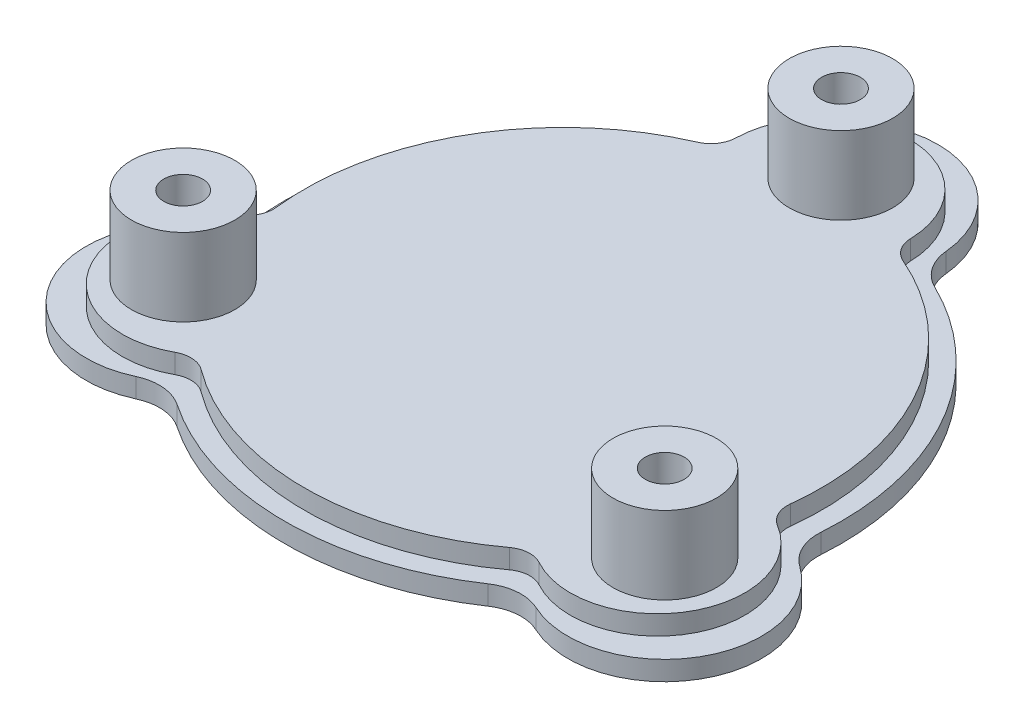
ISO-10303-21;
HEADER;
FILE_DESCRIPTION(('STEP AP214'),'2;1');
FILE_NAME('part.step','',(''),(''),'','','');
FILE_SCHEMA(('AUTOMOTIVE_DESIGN { 1 0 10303 214 1 1 1 1 }'));
ENDSEC;
DATA;
#1=APPLICATION_CONTEXT('core data for automotive mechanical design processes');
#2=APPLICATION_PROTOCOL_DEFINITION('international standard','automotive_design',2000,#1);
#3=PRODUCT_CONTEXT('',#1,'mechanical');
#4=PRODUCT('Part','Part','',(#3));
#5=PRODUCT_RELATED_PRODUCT_CATEGORY('part','',(#4));
#6=PRODUCT_DEFINITION_FORMATION('','',#4);
#7=PRODUCT_DEFINITION_CONTEXT('part definition',#1,'design');
#8=PRODUCT_DEFINITION('design','',#6,#7);
#9=PRODUCT_DEFINITION_SHAPE('','',#8);
#10=(LENGTH_UNIT() NAMED_UNIT(*) SI_UNIT(.MILLI.,.METRE.));
#11=(NAMED_UNIT(*) PLANE_ANGLE_UNIT() SI_UNIT($,.RADIAN.));
#12=(NAMED_UNIT(*) SI_UNIT($,.STERADIAN.) SOLID_ANGLE_UNIT());
#13=UNCERTAINTY_MEASURE_WITH_UNIT(LENGTH_MEASURE(1.E-05),#10,'distance_accuracy_value','');
#14=(GEOMETRIC_REPRESENTATION_CONTEXT(3) GLOBAL_UNCERTAINTY_ASSIGNED_CONTEXT((#13)) GLOBAL_UNIT_ASSIGNED_CONTEXT((#10,
#11,#12)) REPRESENTATION_CONTEXT('',''));
#15=CARTESIAN_POINT('',(0.,0.,0.));
#16=DIRECTION('',(0.,0.,1.));
#17=DIRECTION('',(1.,0.,0.));
#18=AXIS2_PLACEMENT_3D('',#15,#16,#17);
#19=CARTESIAN_POINT('',(-8.748024190987,6.,-40.1859375));
#20=DIRECTION('',(0.,1.,0.));
#21=DIRECTION('',(0.,0.,1.));
#22=AXIS2_PLACEMENT_3D('',#19,#20,#21);
#23=PLANE('',#22);
#24=CARTESIAN_POINT('',(37.2390923627308,6.,21.5000000000002));
#25=DIRECTION('',(0.,1.,0.));
#26=DIRECTION('',(0.,0.,1.));
#27=AXIS2_PLACEMENT_3D('',#24,#25,#26);
#28=CIRCLE('',#27,8.);
#29=CARTESIAN_POINT('',(37.2390923627308,6.,29.5000000000002));
#30=VERTEX_POINT('',#29);
#31=EDGE_CURVE('E669',#30,#30,#28,.T.);
#32=ORIENTED_EDGE('',*,*,#31,.F.);
#33=EDGE_LOOP('',(#32));
#34=FACE_BOUND('',#33,.T.);
#35=CARTESIAN_POINT('',(-17.496048381974,6.,-40.371875));
#36=DIRECTION('',(0.,-1.,0.));
#37=DIRECTION('',(0.,0.,1.));
#38=AXIS2_PLACEMENT_3D('',#35,#36,#37);
#39=CIRCLE('',#38,4.);
#40=CARTESIAN_POINT('',(-13.4969516089514,6.,-40.286875));
#41=VERTEX_POINT('',#40);
#42=CARTESIAN_POINT('',(-15.9054985290673,6.,-36.7017045454546));
#43=VERTEX_POINT('',#42);
#44=EDGE_CURVE('E210',#41,#43,#39,.T.);
#45=ORIENTED_EDGE('',*,*,#44,.T.);
#46=CARTESIAN_POINT('',(0.,6.,0.));
#47=DIRECTION('',(0.,1.,0.));
#48=DIRECTION('',(0.,0.,1.));
#49=AXIS2_PLACEMENT_3D('',#46,#47,#48);
#50=CIRCLE('',#49,40.);
#51=CARTESIAN_POINT('',(-39.7373577630881,6.,4.57628648669901));
#52=VERTEX_POINT('',#51);
#53=EDGE_CURVE('E199',#43,#52,#50,.T.);
#54=ORIENTED_EDGE('',*,*,#53,.T.);
#55=CARTESIAN_POINT('',(-43.7110935393969,6.,5.03391513536889));
#56=DIRECTION('',(0.,-1.,0.));
#57=DIRECTION('',(0.,0.,-1.));
#58=AXIS2_PLACEMENT_3D('',#55,#56,#57);
#59=CIRCLE('',#58,4.00000000000001);
#60=CARTESIAN_POINT('',(-41.6379329935641,6.,8.45473453299854));
#61=VERTEX_POINT('',#60);
#62=EDGE_CURVE('E209',#52,#61,#59,.T.);
#63=ORIENTED_EDGE('',*,*,#62,.T.);
#64=CARTESIAN_POINT('',(-34.6410161513777,6.,19.9999999999997));
#65=DIRECTION('',(0.,1.,0.));
#66=DIRECTION('',(0.,0.,1.));
#67=AXIS2_PLACEMENT_3D('',#64,#65,#66);
#68=CIRCLE('',#67,13.5);
#69=CARTESIAN_POINT('',(-28.1409813846125,6.,31.8321404670011));
#70=VERTEX_POINT('',#69);
#71=EDGE_CURVE('E686',#61,#70,#68,.T.);
#72=ORIENTED_EDGE('',*,*,#71,.T.);
#73=CARTESIAN_POINT('',(-26.2150451574229,6.,35.3379598646311));
#74=DIRECTION('',(0.,-1.,0.));
#75=DIRECTION('',(0.,0.,1.));
#76=AXIS2_PLACEMENT_3D('',#73,#74,#75);
#77=CIRCLE('',#76,3.99999999999999);
#78=CARTESIAN_POINT('',(-23.8318592340208,6.,32.1254180587556));
#79=VERTEX_POINT('',#78);
#80=EDGE_CURVE('E688',#70,#79,#77,.T.);
#81=ORIENTED_EDGE('',*,*,#80,.T.);
#82=CARTESIAN_POINT('',(0.,6.,0.));
#83=DIRECTION('',(0.,1.,0.));
#84=DIRECTION('',(0.,0.,1.));
#85=AXIS2_PLACEMENT_3D('',#82,#83,#84);
#86=CIRCLE('',#85,40.);
#87=CARTESIAN_POINT('',(23.8318592340208,6.,32.1254180587555));
#88=VERTEX_POINT('',#87);
#89=EDGE_CURVE('E690',#79,#88,#86,.T.);
#90=ORIENTED_EDGE('',*,*,#89,.T.);
#91=CARTESIAN_POINT('',(26.2150451574229,6.,35.3379598646311));
#92=DIRECTION('',(0.,-1.,0.));
#93=DIRECTION('',(0.,0.,-1.));
#94=AXIS2_PLACEMENT_3D('',#91,#92,#93);
#95=CIRCLE('',#94,4.);
#96=CARTESIAN_POINT('',(28.1409813846124,6.,31.8321404670013));
#97=VERTEX_POINT('',#96);
#98=EDGE_CURVE('E692',#88,#97,#95,.T.);
#99=ORIENTED_EDGE('',*,*,#98,.T.);
#100=CARTESIAN_POINT('',(34.6410161513775,6.,20.0000000000002));
#101=DIRECTION('',(0.,1.,0.));
#102=DIRECTION('',(0.,0.,1.));
#103=AXIS2_PLACEMENT_3D('',#100,#101,#102);
#104=CIRCLE('',#103,13.5);
#105=CARTESIAN_POINT('',(41.6379329935639,6.,8.45473453299885));
#106=VERTEX_POINT('',#105);
#107=EDGE_CURVE('E694',#97,#106,#104,.T.);
#108=ORIENTED_EDGE('',*,*,#107,.T.);
#109=CARTESIAN_POINT('',(43.7110935393969,6.,5.03391513536888));
#110=DIRECTION('',(0.,-1.,0.));
#111=DIRECTION('',(0.,0.,1.));
#112=AXIS2_PLACEMENT_3D('',#109,#110,#111);
#113=CIRCLE('',#112,4.);
#114=CARTESIAN_POINT('',(39.7373577630881,6.,4.57628648669898));
#115=VERTEX_POINT('',#114);
#116=EDGE_CURVE('E696',#106,#115,#113,.T.);
#117=ORIENTED_EDGE('',*,*,#116,.T.);
#118=CARTESIAN_POINT('',(0.,6.,0.));
#119=DIRECTION('',(0.,1.,0.));
#120=DIRECTION('',(0.,0.,1.));
#121=AXIS2_PLACEMENT_3D('',#118,#119,#120);
#122=CIRCLE('',#121,40.);
#123=CARTESIAN_POINT('',(15.9054985290673,6.,-36.7017045454545));
#124=VERTEX_POINT('',#123);
#125=EDGE_CURVE('E698',#115,#124,#122,.T.);
#126=ORIENTED_EDGE('',*,*,#125,.T.);
#127=CARTESIAN_POINT('',(17.496048381974,6.,-40.371875));
#128=DIRECTION('',(0.,-1.,0.));
#129=DIRECTION('',(0.,0.,-1.));
#130=AXIS2_PLACEMENT_3D('',#127,#128,#129);
#131=CIRCLE('',#130,4.);
#132=CARTESIAN_POINT('',(13.4969516089514,6.,-40.286875));
#133=VERTEX_POINT('',#132);
#134=EDGE_CURVE('E700',#124,#133,#131,.T.);
#135=ORIENTED_EDGE('',*,*,#134,.T.);
#136=CARTESIAN_POINT('',(0.,6.,-40.));
#137=DIRECTION('',(0.,1.,0.));
#138=DIRECTION('',(0.,0.,1.));
#139=AXIS2_PLACEMENT_3D('',#136,#137,#138);
#140=CIRCLE('',#139,13.5);
#141=EDGE_CURVE('E215',#133,#41,#140,.T.);
#142=ORIENTED_EDGE('',*,*,#141,.T.);
#143=EDGE_LOOP('',(#45,#54,#63,#72,#81,#90,#99,#108,#117,#126,#135,#142));
#144=FACE_BOUND('',#143,.T.);
#145=CARTESIAN_POINT('',(0.,6.,-43.));
#146=DIRECTION('',(0.,1.,0.));
#147=DIRECTION('',(0.,0.,1.));
#148=AXIS2_PLACEMENT_3D('',#145,#146,#147);
#149=CIRCLE('',#148,8.);
#150=CARTESIAN_POINT('',(0.,6.,-35.));
#151=VERTEX_POINT('',#150);
#152=EDGE_CURVE('E679',#151,#151,#149,.T.);
#153=ORIENTED_EDGE('',*,*,#152,.F.);
#154=EDGE_LOOP('',(#153));
#155=FACE_BOUND('',#154,.T.);
#156=CARTESIAN_POINT('',(-37.2390923627311,6.,21.4999999999997));
#157=DIRECTION('',(0.,1.,0.));
#158=DIRECTION('',(0.,0.,1.));
#159=AXIS2_PLACEMENT_3D('',#156,#157,#158);
#160=CIRCLE('',#159,8.);
#161=CARTESIAN_POINT('',(-37.2390923627311,6.,29.4999999999997));
#162=VERTEX_POINT('',#161);
#163=EDGE_CURVE('E659',#162,#162,#160,.T.);
#164=ORIENTED_EDGE('',*,*,#163,.F.);
#165=EDGE_LOOP('',(#164));
#166=FACE_BOUND('',#165,.T.);
#167=ADVANCED_FACE('F41',(#34,#144,#155,#166),#23,.T.);
#168=CARTESIAN_POINT('',(49.8778588175734,3.,3.49273528544831));
#169=DIRECTION('',(0.,-1.,0.));
#170=DIRECTION('',(0.,0.,-1.));
#171=AXIS2_PLACEMENT_3D('',#168,#169,#170);
#172=CYLINDRICAL_SURFACE('',#171,7.);
#173=CARTESIAN_POINT('',(49.8778588175734,0.,3.49273528544831));
#174=DIRECTION('',(0.,1.,0.));
#175=DIRECTION('',(0.,0.,1.));
#176=AXIS2_PLACEMENT_3D('',#173,#174,#175);
#177=CIRCLE('',#176,7.);
#178=CARTESIAN_POINT('',(42.8949585831131,0.,3.00375234548555));
#179=VERTEX_POINT('',#178);
#180=CARTESIAN_POINT('',(45.8564331273962,0.,9.22231951280574));
#181=VERTEX_POINT('',#180);
#182=EDGE_CURVE('E221',#179,#181,#177,.T.);
#183=ORIENTED_EDGE('',*,*,#182,.F.);
#184=DIRECTION('',(0.,-1.,0.));
#185=VECTOR('',#184,1.);
#186=CARTESIAN_POINT('',(42.8949585831131,3.,3.00375234548555));
#187=LINE('',#186,#185);
#188=CARTESIAN_POINT('',(42.8949585831131,3.,3.00375234548555));
#189=VERTEX_POINT('',#188);
#190=EDGE_CURVE('E11',#189,#179,#187,.T.);
#191=ORIENTED_EDGE('',*,*,#190,.F.);
#192=CARTESIAN_POINT('',(49.8778588175734,3.,3.49273528544831));
#193=DIRECTION('',(0.,1.,0.));
#194=DIRECTION('',(0.,0.,1.));
#195=AXIS2_PLACEMENT_3D('',#192,#193,#194);
#196=CIRCLE('',#195,7.);
#197=CARTESIAN_POINT('',(45.8564331273962,3.,9.22231951280574));
#198=VERTEX_POINT('',#197);
#199=EDGE_CURVE('E230',#189,#198,#196,.T.);
#200=ORIENTED_EDGE('',*,*,#199,.T.);
#201=DIRECTION('',(0.,-1.,0.));
#202=VECTOR('',#201,1.);
#203=CARTESIAN_POINT('',(45.8564331273962,3.,9.22231951280574));
#204=LINE('',#203,#202);
#205=EDGE_CURVE('E257',#198,#181,#204,.T.);
#206=ORIENTED_EDGE('',*,*,#205,.T.);
#207=EDGE_LOOP('',(#183,#191,#200,#206));
#208=FACE_BOUND('',#207,.T.);
#209=ADVANCED_FACE('F43',(#208),#172,.F.);
#210=CARTESIAN_POINT('',(0.,3.,0.));
#211=DIRECTION('',(0.,-1.,0.));
#212=DIRECTION('',(0.,0.,-1.));
#213=AXIS2_PLACEMENT_3D('',#210,#211,#212);
#214=CYLINDRICAL_SURFACE('',#213,43.);
#215=CARTESIAN_POINT('',(0.,0.,0.));
#216=DIRECTION('',(0.,1.,0.));
#217=DIRECTION('',(0.,0.,1.));
#218=AXIS2_PLACEMENT_3D('',#215,#216,#217);
#219=CIRCLE('',#218,43.);
#220=CARTESIAN_POINT('',(18.8461534536892,0.,-38.65));
#221=VERTEX_POINT('',#220);
#222=EDGE_CURVE('E224',#179,#221,#219,.T.);
#223=ORIENTED_EDGE('',*,*,#222,.T.);
#224=DIRECTION('',(0.,-1.,0.));
#225=VECTOR('',#224,1.);
#226=CARTESIAN_POINT('',(18.8461534536892,3.,-38.65));
#227=LINE('',#226,#225);
#228=CARTESIAN_POINT('',(18.8461534536892,3.,-38.65));
#229=VERTEX_POINT('',#228);
#230=EDGE_CURVE('E49',#229,#221,#227,.T.);
#231=ORIENTED_EDGE('',*,*,#230,.F.);
#232=CARTESIAN_POINT('',(0.,3.,0.));
#233=DIRECTION('',(0.,1.,0.));
#234=DIRECTION('',(0.,0.,1.));
#235=AXIS2_PLACEMENT_3D('',#232,#233,#234);
#236=CIRCLE('',#235,43.);
#237=EDGE_CURVE('E233',#189,#229,#236,.T.);
#238=ORIENTED_EDGE('',*,*,#237,.F.);
#239=ORIENTED_EDGE('',*,*,#190,.T.);
#240=EDGE_LOOP('',(#223,#231,#238,#239));
#241=FACE_BOUND('',#240,.T.);
#242=ADVANCED_FACE('F341',(#241),#214,.T.);
#243=CARTESIAN_POINT('',(21.9141319228944,3.,-44.9418604651163));
#244=DIRECTION('',(0.,-1.,0.));
#245=DIRECTION('',(0.,0.,-1.));
#246=AXIS2_PLACEMENT_3D('',#243,#244,#245);
#247=CYLINDRICAL_SURFACE('',#246,7.);
#248=CARTESIAN_POINT('',(21.9141319228944,0.,-44.9418604651163));
#249=DIRECTION('',(0.,1.,0.));
#250=DIRECTION('',(0.,0.,1.));
#251=AXIS2_PLACEMENT_3D('',#248,#249,#250);
#252=CIRCLE('',#251,7.);
#253=CARTESIAN_POINT('',(14.9414535837916,0.,-44.3239957716702));
#254=VERTEX_POINT('',#253);
#255=EDGE_CURVE('E260',#221,#254,#252,.F.);
#256=ORIENTED_EDGE('',*,*,#255,.T.);
#257=DIRECTION('',(0.,-1.,0.));
#258=VECTOR('',#257,1.);
#259=CARTESIAN_POINT('',(14.9414535837916,3.,-44.3239957716702));
#260=LINE('',#259,#258);
#261=CARTESIAN_POINT('',(14.9414535837916,3.,-44.3239957716702));
#262=VERTEX_POINT('',#261);
#263=EDGE_CURVE('E314',#262,#254,#260,.T.);
#264=ORIENTED_EDGE('',*,*,#263,.F.);
#265=CARTESIAN_POINT('',(21.9141319228944,3.,-44.9418604651163));
#266=DIRECTION('',(0.,1.,0.));
#267=DIRECTION('',(0.,0.,1.));
#268=AXIS2_PLACEMENT_3D('',#265,#266,#267);
#269=CIRCLE('',#268,7.);
#270=EDGE_CURVE('E236',#229,#262,#269,.F.);
#271=ORIENTED_EDGE('',*,*,#270,.F.);
#272=ORIENTED_EDGE('',*,*,#230,.T.);
#273=EDGE_LOOP('',(#256,#264,#271,#272));
#274=FACE_BOUND('',#273,.T.);
#275=ADVANCED_FACE('F321',(#274),#247,.F.);
#276=CARTESIAN_POINT('',(0.,3.,-43.));
#277=DIRECTION('',(0.,-1.,0.));
#278=DIRECTION('',(0.,0.,-1.));
#279=AXIS2_PLACEMENT_3D('',#276,#277,#278);
#280=CYLINDRICAL_SURFACE('',#279,15.);
#281=CARTESIAN_POINT('',(0.,0.,-43.));
#282=DIRECTION('',(0.,1.,0.));
#283=DIRECTION('',(0.,0.,1.));
#284=AXIS2_PLACEMENT_3D('',#281,#282,#283);
#285=CIRCLE('',#284,15.);
#286=CARTESIAN_POINT('',(-14.9414535837916,0.,-44.3239957716702));
#287=VERTEX_POINT('',#286);
#288=EDGE_CURVE('E262',#254,#287,#285,.T.);
#289=ORIENTED_EDGE('',*,*,#288,.T.);
#290=DIRECTION('',(0.,-1.,0.));
#291=VECTOR('',#290,1.);
#292=CARTESIAN_POINT('',(-14.9414535837916,3.,-44.3239957716702));
#293=LINE('',#292,#291);
#294=CARTESIAN_POINT('',(-14.9414535837916,3.,-44.3239957716702));
#295=VERTEX_POINT('',#294);
#296=EDGE_CURVE('E312',#295,#287,#293,.T.);
#297=ORIENTED_EDGE('',*,*,#296,.F.);
#298=CARTESIAN_POINT('',(0.,3.,-43.));
#299=DIRECTION('',(0.,1.,0.));
#300=DIRECTION('',(0.,0.,1.));
#301=AXIS2_PLACEMENT_3D('',#298,#299,#300);
#302=CIRCLE('',#301,15.);
#303=EDGE_CURVE('E238',#262,#295,#302,.T.);
#304=ORIENTED_EDGE('',*,*,#303,.F.);
#305=ORIENTED_EDGE('',*,*,#263,.T.);
#306=EDGE_LOOP('',(#289,#297,#304,#305));
#307=FACE_BOUND('',#306,.T.);
#308=ADVANCED_FACE('F335',(#307),#280,.T.);
#309=CARTESIAN_POINT('',(-21.9141319228944,3.,-44.9418604651163));
#310=DIRECTION('',(0.,-1.,0.));
#311=DIRECTION('',(0.,0.,-1.));
#312=AXIS2_PLACEMENT_3D('',#309,#310,#311);
#313=CYLINDRICAL_SURFACE('',#312,7.);
#314=CARTESIAN_POINT('',(-21.9141319228944,0.,-44.9418604651163));
#315=DIRECTION('',(0.,1.,0.));
#316=DIRECTION('',(0.,0.,1.));
#317=AXIS2_PLACEMENT_3D('',#314,#315,#316);
#318=CIRCLE('',#317,7.);
#319=CARTESIAN_POINT('',(-18.8461534536892,0.,-38.65));
#320=VERTEX_POINT('',#319);
#321=EDGE_CURVE('E265',#320,#287,#318,.T.);
#322=ORIENTED_EDGE('',*,*,#321,.F.);
#323=DIRECTION('',(0.,-1.,0.));
#324=VECTOR('',#323,1.);
#325=CARTESIAN_POINT('',(-18.8461534536892,3.,-38.65));
#326=LINE('',#325,#324);
#327=CARTESIAN_POINT('',(-18.8461534536892,3.,-38.65));
#328=VERTEX_POINT('',#327);
#329=EDGE_CURVE('E310',#328,#320,#326,.T.);
#330=ORIENTED_EDGE('',*,*,#329,.F.);
#331=CARTESIAN_POINT('',(-21.9141319228944,3.,-44.9418604651163));
#332=DIRECTION('',(0.,1.,0.));
#333=DIRECTION('',(0.,0.,1.));
#334=AXIS2_PLACEMENT_3D('',#331,#332,#333);
#335=CIRCLE('',#334,7.);
#336=EDGE_CURVE('E240',#328,#295,#335,.T.);
#337=ORIENTED_EDGE('',*,*,#336,.T.);
#338=ORIENTED_EDGE('',*,*,#296,.T.);
#339=EDGE_LOOP('',(#322,#330,#337,#338));
#340=FACE_BOUND('',#339,.T.);
#341=ADVANCED_FACE('F377',(#340),#313,.F.);
#342=CARTESIAN_POINT('',(0.,3.,0.));
#343=DIRECTION('',(0.,-1.,0.));
#344=DIRECTION('',(0.,0.,-1.));
#345=AXIS2_PLACEMENT_3D('',#342,#343,#344);
#346=CYLINDRICAL_SURFACE('',#345,43.);
#347=CARTESIAN_POINT('',(0.,0.,0.));
#348=DIRECTION('',(0.,1.,0.));
#349=DIRECTION('',(0.,0.,1.));
#350=AXIS2_PLACEMENT_3D('',#347,#348,#349);
#351=CIRCLE('',#350,43.);
#352=CARTESIAN_POINT('',(-42.8949585831132,0.,3.00375234548494));
#353=VERTEX_POINT('',#352);
#354=EDGE_CURVE('E268',#320,#353,#351,.T.);
#355=ORIENTED_EDGE('',*,*,#354,.T.);
#356=DIRECTION('',(0.,-1.,0.));
#357=VECTOR('',#356,1.);
#358=CARTESIAN_POINT('',(-42.8949585831132,3.,3.00375234548494));
#359=LINE('',#358,#357);
#360=CARTESIAN_POINT('',(-42.8949585831132,3.,3.00375234548494));
#361=VERTEX_POINT('',#360);
#362=EDGE_CURVE('E307',#361,#353,#359,.T.);
#363=ORIENTED_EDGE('',*,*,#362,.F.);
#364=CARTESIAN_POINT('',(0.,3.,0.));
#365=DIRECTION('',(0.,1.,0.));
#366=DIRECTION('',(0.,0.,1.));
#367=AXIS2_PLACEMENT_3D('',#364,#365,#366);
#368=CIRCLE('',#367,43.);
#369=EDGE_CURVE('E243',#328,#361,#368,.T.);
#370=ORIENTED_EDGE('',*,*,#369,.F.);
#371=ORIENTED_EDGE('',*,*,#329,.T.);
#372=EDGE_LOOP('',(#355,#363,#370,#371));
#373=FACE_BOUND('',#372,.T.);
#374=ADVANCED_FACE('F375',(#373),#346,.T.);
#375=CARTESIAN_POINT('',(-49.8778588175735,3.,3.49273528544762));
#376=DIRECTION('',(0.,-1.,0.));
#377=DIRECTION('',(0.,0.,-1.));
#378=AXIS2_PLACEMENT_3D('',#375,#376,#377);
#379=CYLINDRICAL_SURFACE('',#378,6.99999999999999);
#380=CARTESIAN_POINT('',(-49.8778588175735,0.,3.49273528544762));
#381=DIRECTION('',(0.,1.,0.));
#382=DIRECTION('',(0.,0.,1.));
#383=AXIS2_PLACEMENT_3D('',#380,#381,#382);
#384=CIRCLE('',#383,6.99999999999999);
#385=CARTESIAN_POINT('',(-45.8564331273963,0.,9.22231951280508));
#386=VERTEX_POINT('',#385);
#387=EDGE_CURVE('E270',#353,#386,#384,.F.);
#388=ORIENTED_EDGE('',*,*,#387,.T.);
#389=DIRECTION('',(0.,-1.,0.));
#390=VECTOR('',#389,1.);
#391=CARTESIAN_POINT('',(-45.8564331273963,3.,9.22231951280508));
#392=LINE('',#391,#390);
#393=CARTESIAN_POINT('',(-45.8564331273963,3.,9.22231951280508));
#394=VERTEX_POINT('',#393);
#395=EDGE_CURVE('E304',#394,#386,#392,.T.);
#396=ORIENTED_EDGE('',*,*,#395,.F.);
#397=CARTESIAN_POINT('',(-49.8778588175735,3.,3.49273528544762));
#398=DIRECTION('',(0.,1.,0.));
#399=DIRECTION('',(0.,0.,1.));
#400=AXIS2_PLACEMENT_3D('',#397,#398,#399);
#401=CIRCLE('',#400,6.99999999999999);
#402=EDGE_CURVE('E245',#361,#394,#401,.F.);
#403=ORIENTED_EDGE('',*,*,#402,.F.);
#404=ORIENTED_EDGE('',*,*,#362,.T.);
#405=EDGE_LOOP('',(#388,#396,#403,#404));
#406=FACE_BOUND('',#405,.T.);
#407=ADVANCED_FACE('F370',(#406),#379,.F.);
#408=CARTESIAN_POINT('',(-37.2390923627311,3.,21.4999999999997));
#409=DIRECTION('',(0.,-1.,0.));
#410=DIRECTION('',(0.,0.,-1.));
#411=AXIS2_PLACEMENT_3D('',#408,#409,#410);
#412=CYLINDRICAL_SURFACE('',#411,15.);
#413=CARTESIAN_POINT('',(-37.2390923627311,0.,21.4999999999997));
#414=DIRECTION('',(0.,1.,0.));
#415=DIRECTION('',(0.,0.,1.));
#416=AXIS2_PLACEMENT_3D('',#413,#414,#415);
#417=CIRCLE('',#416,15.);
#418=CARTESIAN_POINT('',(-30.914979543605,0.,35.1016762588644));
#419=VERTEX_POINT('',#418);
#420=EDGE_CURVE('E272',#386,#419,#417,.T.);
#421=ORIENTED_EDGE('',*,*,#420,.T.);
#422=DIRECTION('',(0.,-1.,0.));
#423=VECTOR('',#422,1.);
#424=CARTESIAN_POINT('',(-30.914979543605,3.,35.1016762588644));
#425=LINE('',#424,#423);
#426=CARTESIAN_POINT('',(-30.914979543605,3.,35.1016762588644));
#427=VERTEX_POINT('',#426);
#428=EDGE_CURVE('E302',#427,#419,#425,.T.);
#429=ORIENTED_EDGE('',*,*,#428,.F.);
#430=CARTESIAN_POINT('',(-37.2390923627311,3.,21.4999999999997));
#431=DIRECTION('',(0.,1.,0.));
#432=DIRECTION('',(0.,0.,1.));
#433=AXIS2_PLACEMENT_3D('',#430,#431,#432);
#434=CIRCLE('',#433,15.);
#435=EDGE_CURVE('E247',#394,#427,#434,.T.);
#436=ORIENTED_EDGE('',*,*,#435,.F.);
#437=ORIENTED_EDGE('',*,*,#395,.T.);
#438=EDGE_LOOP('',(#421,#429,#436,#437));
#439=FACE_BOUND('',#438,.T.);
#440=ADVANCED_FACE('F366',(#439),#412,.T.);
#441=CARTESIAN_POINT('',(-27.9637268946794,3.,41.4491251796679));
#442=DIRECTION('',(0.,-1.,0.));
#443=DIRECTION('',(0.,0.,-1.));
#444=AXIS2_PLACEMENT_3D('',#441,#442,#443);
#445=CYLINDRICAL_SURFACE('',#444,7.);
#446=CARTESIAN_POINT('',(-27.9637268946794,0.,41.4491251796679));
#447=DIRECTION('',(0.,1.,0.));
#448=DIRECTION('',(0.,0.,1.));
#449=AXIS2_PLACEMENT_3D('',#446,#447,#448);
#450=CIRCLE('',#449,7.);
#451=CARTESIAN_POINT('',(-24.0488051294243,0.,35.6462476545144));
#452=VERTEX_POINT('',#451);
#453=EDGE_CURVE('E275',#452,#419,#450,.T.);
#454=ORIENTED_EDGE('',*,*,#453,.F.);
#455=DIRECTION('',(0.,-1.,0.));
#456=VECTOR('',#455,1.);
#457=CARTESIAN_POINT('',(-24.0488051294243,3.,35.6462476545144));
#458=LINE('',#457,#456);
#459=CARTESIAN_POINT('',(-24.0488051294243,3.,35.6462476545144));
#460=VERTEX_POINT('',#459);
#461=EDGE_CURVE('E300',#460,#452,#458,.T.);
#462=ORIENTED_EDGE('',*,*,#461,.F.);
#463=CARTESIAN_POINT('',(-27.9637268946794,3.,41.4491251796679));
#464=DIRECTION('',(0.,1.,0.));
#465=DIRECTION('',(0.,0.,1.));
#466=AXIS2_PLACEMENT_3D('',#463,#464,#465);
#467=CIRCLE('',#466,7.);
#468=EDGE_CURVE('E249',#460,#427,#467,.T.);
#469=ORIENTED_EDGE('',*,*,#468,.T.);
#470=ORIENTED_EDGE('',*,*,#428,.T.);
#471=EDGE_LOOP('',(#454,#462,#469,#470));
#472=FACE_BOUND('',#471,.T.);
#473=ADVANCED_FACE('F362',(#472),#445,.F.);
#474=CARTESIAN_POINT('',(0.,3.,0.));
#475=DIRECTION('',(0.,-1.,0.));
#476=DIRECTION('',(0.,0.,-1.));
#477=AXIS2_PLACEMENT_3D('',#474,#475,#476);
#478=CYLINDRICAL_SURFACE('',#477,43.);
#479=CARTESIAN_POINT('',(0.,0.,0.));
#480=DIRECTION('',(0.,1.,0.));
#481=DIRECTION('',(0.,0.,1.));
#482=AXIS2_PLACEMENT_3D('',#479,#480,#481);
#483=CIRCLE('',#482,43.);
#484=CARTESIAN_POINT('',(24.0488051294238,0.,35.6462476545148));
#485=VERTEX_POINT('',#484);
#486=EDGE_CURVE('E278',#452,#485,#483,.T.);
#487=ORIENTED_EDGE('',*,*,#486,.T.);
#488=DIRECTION('',(0.,-1.,0.));
#489=VECTOR('',#488,1.);
#490=CARTESIAN_POINT('',(24.0488051294238,3.,35.6462476545148));
#491=LINE('',#490,#489);
#492=CARTESIAN_POINT('',(24.0488051294238,3.,35.6462476545148));
#493=VERTEX_POINT('',#492);
#494=EDGE_CURVE('E297',#493,#485,#491,.T.);
#495=ORIENTED_EDGE('',*,*,#494,.F.);
#496=CARTESIAN_POINT('',(0.,3.,0.));
#497=DIRECTION('',(0.,1.,0.));
#498=DIRECTION('',(0.,0.,1.));
#499=AXIS2_PLACEMENT_3D('',#496,#497,#498);
#500=CIRCLE('',#499,43.);
#501=EDGE_CURVE('E252',#460,#493,#500,.T.);
#502=ORIENTED_EDGE('',*,*,#501,.F.);
#503=ORIENTED_EDGE('',*,*,#461,.T.);
#504=EDGE_LOOP('',(#487,#495,#502,#503));
#505=FACE_BOUND('',#504,.T.);
#506=ADVANCED_FACE('F357',(#505),#478,.T.);
#507=CARTESIAN_POINT('',(27.9637268946789,3.,41.4491251796683));
#508=DIRECTION('',(0.,-1.,0.));
#509=DIRECTION('',(0.,0.,-1.));
#510=AXIS2_PLACEMENT_3D('',#507,#508,#509);
#511=CYLINDRICAL_SURFACE('',#510,7.00000000000001);
#512=CARTESIAN_POINT('',(27.9637268946789,0.,41.4491251796683));
#513=DIRECTION('',(0.,1.,0.));
#514=DIRECTION('',(0.,0.,1.));
#515=AXIS2_PLACEMENT_3D('',#512,#513,#514);
#516=CIRCLE('',#515,7.00000000000001);
#517=CARTESIAN_POINT('',(30.9149795436045,0.,35.1016762588648));
#518=VERTEX_POINT('',#517);
#519=EDGE_CURVE('E280',#485,#518,#516,.F.);
#520=ORIENTED_EDGE('',*,*,#519,.T.);
#521=DIRECTION('',(0.,-1.,0.));
#522=VECTOR('',#521,1.);
#523=CARTESIAN_POINT('',(30.9149795436045,3.,35.1016762588648));
#524=LINE('',#523,#522);
#525=CARTESIAN_POINT('',(30.9149795436045,3.,35.1016762588648));
#526=VERTEX_POINT('',#525);
#527=EDGE_CURVE('E294',#526,#518,#524,.T.);
#528=ORIENTED_EDGE('',*,*,#527,.F.);
#529=CARTESIAN_POINT('',(27.9637268946789,3.,41.4491251796683));
#530=DIRECTION('',(0.,1.,0.));
#531=DIRECTION('',(0.,0.,1.));
#532=AXIS2_PLACEMENT_3D('',#529,#530,#531);
#533=CIRCLE('',#532,7.00000000000001);
#534=EDGE_CURVE('E254',#493,#526,#533,.F.);
#535=ORIENTED_EDGE('',*,*,#534,.F.);
#536=ORIENTED_EDGE('',*,*,#494,.T.);
#537=EDGE_LOOP('',(#520,#528,#535,#536));
#538=FACE_BOUND('',#537,.T.);
#539=ADVANCED_FACE('F353',(#538),#511,.F.);
#540=CARTESIAN_POINT('',(-37.2390923627311,3.,21.4999999999997));
#541=DIRECTION('',(0.,-1.,0.));
#542=DIRECTION('',(0.,0.,-1.));
#543=AXIS2_PLACEMENT_3D('',#540,#541,#542);
#544=CYLINDRICAL_SURFACE('',#543,3.);
#545=CARTESIAN_POINT('',(-37.2390923627311,0.,21.4999999999997));
#546=DIRECTION('',(0.,1.,0.));
#547=DIRECTION('',(0.,0.,1.));
#548=AXIS2_PLACEMENT_3D('',#545,#546,#547);
#549=CIRCLE('',#548,3.);
#550=CARTESIAN_POINT('',(-37.2390923627311,0.,24.4999999999997));
#551=VERTEX_POINT('',#550);
#552=EDGE_CURVE('E288',#551,#551,#549,.T.);
#553=ORIENTED_EDGE('',*,*,#552,.F.);
#554=EDGE_LOOP('',(#553));
#555=FACE_BOUND('',#554,.T.);
#556=CARTESIAN_POINT('',(-37.2390923627311,18.,21.4999999999997));
#557=DIRECTION('',(0.,1.,0.));
#558=DIRECTION('',(0.,0.,1.));
#559=AXIS2_PLACEMENT_3D('',#556,#557,#558);
#560=CIRCLE('',#559,3.);
#561=CARTESIAN_POINT('',(-37.2390923627311,18.,24.4999999999997));
#562=VERTEX_POINT('',#561);
#563=EDGE_CURVE('E661',#562,#562,#560,.T.);
#564=ORIENTED_EDGE('',*,*,#563,.T.);
#565=EDGE_LOOP('',(#564));
#566=FACE_BOUND('',#565,.T.);
#567=ADVANCED_FACE('F452',(#555,#566),#544,.F.);
#568=CARTESIAN_POINT('',(0.,3.,-43.));
#569=DIRECTION('',(0.,-1.,0.));
#570=DIRECTION('',(0.,0.,-1.));
#571=AXIS2_PLACEMENT_3D('',#568,#569,#570);
#572=CYLINDRICAL_SURFACE('',#571,3.);
#573=CARTESIAN_POINT('',(0.,0.,-43.));
#574=DIRECTION('',(0.,1.,0.));
#575=DIRECTION('',(0.,0.,1.));
#576=AXIS2_PLACEMENT_3D('',#573,#574,#575);
#577=CIRCLE('',#576,3.);
#578=CARTESIAN_POINT('',(0.,0.,-40.));
#579=VERTEX_POINT('',#578);
#580=EDGE_CURVE('E285',#579,#579,#577,.T.);
#581=ORIENTED_EDGE('',*,*,#580,.F.);
#582=EDGE_LOOP('',(#581));
#583=FACE_BOUND('',#582,.T.);
#584=CARTESIAN_POINT('',(0.,18.,-43.));
#585=DIRECTION('',(0.,1.,0.));
#586=DIRECTION('',(0.,0.,1.));
#587=AXIS2_PLACEMENT_3D('',#584,#585,#586);
#588=CIRCLE('',#587,3.);
#589=CARTESIAN_POINT('',(0.,18.,-40.));
#590=VERTEX_POINT('',#589);
#591=EDGE_CURVE('E663',#590,#590,#588,.T.);
#592=ORIENTED_EDGE('',*,*,#591,.T.);
#593=EDGE_LOOP('',(#592));
#594=FACE_BOUND('',#593,.T.);
#595=ADVANCED_FACE('F454',(#583,#594),#572,.F.);
#596=CARTESIAN_POINT('',(37.2390923627308,3.,21.5000000000002));
#597=DIRECTION('',(0.,-1.,0.));
#598=DIRECTION('',(0.,0.,-1.));
#599=AXIS2_PLACEMENT_3D('',#596,#597,#598);
#600=CYLINDRICAL_SURFACE('',#599,15.);
#601=CARTESIAN_POINT('',(37.2390923627308,0.,21.5000000000002));
#602=DIRECTION('',(0.,1.,0.));
#603=DIRECTION('',(0.,0.,1.));
#604=AXIS2_PLACEMENT_3D('',#601,#602,#603);
#605=CIRCLE('',#604,15.);
#606=EDGE_CURVE('E282',#518,#181,#605,.T.);
#607=ORIENTED_EDGE('',*,*,#606,.T.);
#608=ORIENTED_EDGE('',*,*,#205,.F.);
#609=CARTESIAN_POINT('',(37.2390923627308,3.,21.5000000000002));
#610=DIRECTION('',(0.,1.,0.));
#611=DIRECTION('',(0.,0.,1.));
#612=AXIS2_PLACEMENT_3D('',#609,#610,#611);
#613=CIRCLE('',#612,15.);
#614=EDGE_CURVE('E256',#526,#198,#613,.T.);
#615=ORIENTED_EDGE('',*,*,#614,.F.);
#616=ORIENTED_EDGE('',*,*,#527,.T.);
#617=EDGE_LOOP('',(#607,#608,#615,#616));
#618=FACE_BOUND('',#617,.T.);
#619=ADVANCED_FACE('F348',(#618),#600,.T.);
#620=CARTESIAN_POINT('',(37.2390923627308,3.,21.5000000000002));
#621=DIRECTION('',(0.,-1.,0.));
#622=DIRECTION('',(0.,0.,-1.));
#623=AXIS2_PLACEMENT_3D('',#620,#621,#622);
#624=CYLINDRICAL_SURFACE('',#623,3.);
#625=CARTESIAN_POINT('',(37.2390923627308,0.,21.5000000000002));
#626=DIRECTION('',(0.,1.,0.));
#627=DIRECTION('',(0.,0.,1.));
#628=AXIS2_PLACEMENT_3D('',#625,#626,#627);
#629=CIRCLE('',#628,3.);
#630=CARTESIAN_POINT('',(37.2390923627308,0.,24.5000000000002));
#631=VERTEX_POINT('',#630);
#632=EDGE_CURVE('E234',#631,#631,#629,.T.);
#633=ORIENTED_EDGE('',*,*,#632,.F.);
#634=EDGE_LOOP('',(#633));
#635=FACE_BOUND('',#634,.T.);
#636=CARTESIAN_POINT('',(37.2390923627308,18.,21.5000000000002));
#637=DIRECTION('',(0.,1.,0.));
#638=DIRECTION('',(0.,0.,1.));
#639=AXIS2_PLACEMENT_3D('',#636,#637,#638);
#640=CIRCLE('',#639,3.);
#641=CARTESIAN_POINT('',(37.2390923627308,18.,24.5000000000002));
#642=VERTEX_POINT('',#641);
#643=EDGE_CURVE('E666',#642,#642,#640,.T.);
#644=ORIENTED_EDGE('',*,*,#643,.T.);
#645=EDGE_LOOP('',(#644));
#646=FACE_BOUND('',#645,.T.);
#647=ADVANCED_FACE('F446',(#635,#646),#624,.F.);
#648=CARTESIAN_POINT('',(0.,3.,0.));
#649=DIRECTION('',(0.,1.,0.));
#650=DIRECTION('',(0.,0.,1.));
#651=AXIS2_PLACEMENT_3D('',#648,#649,#650);
#652=PLANE('',#651);
#653=CARTESIAN_POINT('',(-17.496048381974,3.,-40.371875));
#654=DIRECTION('',(0.,-1.,0.));
#655=DIRECTION('',(0.,0.,1.));
#656=AXIS2_PLACEMENT_3D('',#653,#654,#655);
#657=CIRCLE('',#656,4.);
#658=CARTESIAN_POINT('',(-13.4969516089514,3.,-40.286875));
#659=VERTEX_POINT('',#658);
#660=CARTESIAN_POINT('',(-15.9054985290673,3.,-36.7017045454546));
#661=VERTEX_POINT('',#660);
#662=EDGE_CURVE('E56',#659,#661,#657,.T.);
#663=ORIENTED_EDGE('',*,*,#662,.F.);
#664=CARTESIAN_POINT('',(0.,3.,-40.));
#665=DIRECTION('',(0.,1.,0.));
#666=DIRECTION('',(0.,0.,1.));
#667=AXIS2_PLACEMENT_3D('',#664,#665,#666);
#668=CIRCLE('',#667,13.5);
#669=CARTESIAN_POINT('',(13.4969516089514,3.,-40.286875));
#670=VERTEX_POINT('',#669);
#671=EDGE_CURVE('E60',#670,#659,#668,.T.);
#672=ORIENTED_EDGE('',*,*,#671,.F.);
#673=CARTESIAN_POINT('',(17.496048381974,3.,-40.371875));
#674=DIRECTION('',(0.,-1.,0.));
#675=DIRECTION('',(0.,0.,-1.));
#676=AXIS2_PLACEMENT_3D('',#673,#674,#675);
#677=CIRCLE('',#676,4.);
#678=CARTESIAN_POINT('',(15.9054985290673,3.,-36.7017045454545));
#679=VERTEX_POINT('',#678);
#680=EDGE_CURVE('E731',#679,#670,#677,.T.);
#681=ORIENTED_EDGE('',*,*,#680,.F.);
#682=CARTESIAN_POINT('',(0.,3.,0.));
#683=DIRECTION('',(0.,1.,0.));
#684=DIRECTION('',(0.,0.,1.));
#685=AXIS2_PLACEMENT_3D('',#682,#683,#684);
#686=CIRCLE('',#685,40.);
#687=CARTESIAN_POINT('',(39.7373577630881,3.,4.57628648669898));
#688=VERTEX_POINT('',#687);
#689=EDGE_CURVE('E728',#688,#679,#686,.T.);
#690=ORIENTED_EDGE('',*,*,#689,.F.);
#691=CARTESIAN_POINT('',(43.7110935393969,3.,5.03391513536888));
#692=DIRECTION('',(0.,-1.,0.));
#693=DIRECTION('',(0.,0.,1.));
#694=AXIS2_PLACEMENT_3D('',#691,#692,#693);
#695=CIRCLE('',#694,4.);
#696=CARTESIAN_POINT('',(41.6379329935639,3.,8.45473453299885));
#697=VERTEX_POINT('',#696);
#698=EDGE_CURVE('E725',#697,#688,#695,.T.);
#699=ORIENTED_EDGE('',*,*,#698,.F.);
#700=CARTESIAN_POINT('',(34.6410161513775,3.,20.0000000000002));
#701=DIRECTION('',(0.,1.,0.));
#702=DIRECTION('',(0.,0.,1.));
#703=AXIS2_PLACEMENT_3D('',#700,#701,#702);
#704=CIRCLE('',#703,13.5);
#705=CARTESIAN_POINT('',(28.1409813846124,3.,31.8321404670013));
#706=VERTEX_POINT('',#705);
#707=EDGE_CURVE('E722',#706,#697,#704,.T.);
#708=ORIENTED_EDGE('',*,*,#707,.F.);
#709=CARTESIAN_POINT('',(26.2150451574229,3.,35.3379598646311));
#710=DIRECTION('',(0.,-1.,0.));
#711=DIRECTION('',(0.,0.,-1.));
#712=AXIS2_PLACEMENT_3D('',#709,#710,#711);
#713=CIRCLE('',#712,4.);
#714=CARTESIAN_POINT('',(23.8318592340208,3.,32.1254180587555));
#715=VERTEX_POINT('',#714);
#716=EDGE_CURVE('E719',#715,#706,#713,.T.);
#717=ORIENTED_EDGE('',*,*,#716,.F.);
#718=CARTESIAN_POINT('',(0.,3.,0.));
#719=DIRECTION('',(0.,1.,0.));
#720=DIRECTION('',(0.,0.,1.));
#721=AXIS2_PLACEMENT_3D('',#718,#719,#720);
#722=CIRCLE('',#721,40.);
#723=CARTESIAN_POINT('',(-23.8318592340208,3.,32.1254180587556));
#724=VERTEX_POINT('',#723);
#725=EDGE_CURVE('E716',#724,#715,#722,.T.);
#726=ORIENTED_EDGE('',*,*,#725,.F.);
#727=CARTESIAN_POINT('',(-26.2150451574229,3.,35.3379598646311));
#728=DIRECTION('',(0.,-1.,0.));
#729=DIRECTION('',(0.,0.,1.));
#730=AXIS2_PLACEMENT_3D('',#727,#728,#729);
#731=CIRCLE('',#730,3.99999999999999);
#732=CARTESIAN_POINT('',(-28.1409813846125,3.,31.8321404670011));
#733=VERTEX_POINT('',#732);
#734=EDGE_CURVE('E713',#733,#724,#731,.T.);
#735=ORIENTED_EDGE('',*,*,#734,.F.);
#736=CARTESIAN_POINT('',(-34.6410161513777,3.,19.9999999999997));
#737=DIRECTION('',(0.,1.,0.));
#738=DIRECTION('',(0.,0.,1.));
#739=AXIS2_PLACEMENT_3D('',#736,#737,#738);
#740=CIRCLE('',#739,13.5);
#741=CARTESIAN_POINT('',(-41.6379329935641,3.,8.45473453299854));
#742=VERTEX_POINT('',#741);
#743=EDGE_CURVE('E710',#742,#733,#740,.T.);
#744=ORIENTED_EDGE('',*,*,#743,.F.);
#745=CARTESIAN_POINT('',(-43.7110935393969,3.,5.03391513536889));
#746=DIRECTION('',(0.,-1.,0.));
#747=DIRECTION('',(0.,0.,-1.));
#748=AXIS2_PLACEMENT_3D('',#745,#746,#747);
#749=CIRCLE('',#748,4.00000000000001);
#750=CARTESIAN_POINT('',(-39.7373577630881,3.,4.57628648669901));
#751=VERTEX_POINT('',#750);
#752=EDGE_CURVE('E707',#751,#742,#749,.T.);
#753=ORIENTED_EDGE('',*,*,#752,.F.);
#754=CARTESIAN_POINT('',(0.,3.,0.));
#755=DIRECTION('',(0.,1.,0.));
#756=DIRECTION('',(0.,0.,1.));
#757=AXIS2_PLACEMENT_3D('',#754,#755,#756);
#758=CIRCLE('',#757,40.);
#759=EDGE_CURVE('E705',#661,#751,#758,.T.);
#760=ORIENTED_EDGE('',*,*,#759,.F.);
#761=EDGE_LOOP('',(#663,#672,#681,#690,#699,#708,#717,#726,#735,#744,#753,#760));
#762=FACE_BOUND('',#761,.T.);
#763=ORIENTED_EDGE('',*,*,#199,.F.);
#764=ORIENTED_EDGE('',*,*,#237,.T.);
#765=ORIENTED_EDGE('',*,*,#270,.T.);
#766=ORIENTED_EDGE('',*,*,#303,.T.);
#767=ORIENTED_EDGE('',*,*,#336,.F.);
#768=ORIENTED_EDGE('',*,*,#369,.T.);
#769=ORIENTED_EDGE('',*,*,#402,.T.);
#770=ORIENTED_EDGE('',*,*,#435,.T.);
#771=ORIENTED_EDGE('',*,*,#468,.F.);
#772=ORIENTED_EDGE('',*,*,#501,.T.);
#773=ORIENTED_EDGE('',*,*,#534,.T.);
#774=ORIENTED_EDGE('',*,*,#614,.T.);
#775=EDGE_LOOP('',(#763,#764,#765,#766,#767,#768,#769,#770,#771,#772,#773,#774));
#776=FACE_BOUND('',#775,.T.);
#777=ADVANCED_FACE('F340',(#762,#776),#652,.T.);
#778=CARTESIAN_POINT('',(0.,0.,0.));
#779=DIRECTION('',(0.,1.,0.));
#780=DIRECTION('',(0.,0.,1.));
#781=AXIS2_PLACEMENT_3D('',#778,#779,#780);
#782=PLANE('',#781);
#783=ORIENTED_EDGE('',*,*,#182,.T.);
#784=ORIENTED_EDGE('',*,*,#606,.F.);
#785=ORIENTED_EDGE('',*,*,#519,.F.);
#786=ORIENTED_EDGE('',*,*,#486,.F.);
#787=ORIENTED_EDGE('',*,*,#453,.T.);
#788=ORIENTED_EDGE('',*,*,#420,.F.);
#789=ORIENTED_EDGE('',*,*,#387,.F.);
#790=ORIENTED_EDGE('',*,*,#354,.F.);
#791=ORIENTED_EDGE('',*,*,#321,.T.);
#792=ORIENTED_EDGE('',*,*,#288,.F.);
#793=ORIENTED_EDGE('',*,*,#255,.F.);
#794=ORIENTED_EDGE('',*,*,#222,.F.);
#795=EDGE_LOOP('',(#783,#784,#785,#786,#787,#788,#789,#790,#791,#792,#793,#794));
#796=FACE_BOUND('',#795,.T.);
#797=ORIENTED_EDGE('',*,*,#580,.T.);
#798=EDGE_LOOP('',(#797));
#799=FACE_BOUND('',#798,.T.);
#800=ORIENTED_EDGE('',*,*,#552,.T.);
#801=EDGE_LOOP('',(#800));
#802=FACE_BOUND('',#801,.T.);
#803=ORIENTED_EDGE('',*,*,#632,.T.);
#804=EDGE_LOOP('',(#803));
#805=FACE_BOUND('',#804,.T.);
#806=ADVANCED_FACE('F328',(#796,#799,#802,#805),#782,.F.);
#807=CARTESIAN_POINT('',(-17.496048381974,6.,-40.371875));
#808=DIRECTION('',(0.,-1.,0.));
#809=DIRECTION('',(0.,0.,-1.));
#810=AXIS2_PLACEMENT_3D('',#807,#808,#809);
#811=CYLINDRICAL_SURFACE('',#810,4.);
#812=ORIENTED_EDGE('',*,*,#662,.T.);
#813=DIRECTION('',(0.,-1.,0.));
#814=VECTOR('',#813,1.);
#815=CARTESIAN_POINT('',(-15.9054985290673,6.,-36.7017045454546));
#816=LINE('',#815,#814);
#817=EDGE_CURVE('E204',#43,#661,#816,.T.);
#818=ORIENTED_EDGE('',*,*,#817,.F.);
#819=ORIENTED_EDGE('',*,*,#44,.F.);
#820=DIRECTION('',(0.,-1.,0.));
#821=VECTOR('',#820,1.);
#822=CARTESIAN_POINT('',(-13.4969516089514,6.,-40.286875));
#823=LINE('',#822,#821);
#824=EDGE_CURVE('E703',#41,#659,#823,.T.);
#825=ORIENTED_EDGE('',*,*,#824,.T.);
#826=EDGE_LOOP('',(#812,#818,#819,#825));
#827=FACE_BOUND('',#826,.T.);
#828=ADVANCED_FACE('F220',(#827),#811,.F.);
#829=CARTESIAN_POINT('',(0.,6.,0.));
#830=DIRECTION('',(0.,-1.,0.));
#831=DIRECTION('',(0.,0.,-1.));
#832=AXIS2_PLACEMENT_3D('',#829,#830,#831);
#833=CYLINDRICAL_SURFACE('',#832,40.);
#834=ORIENTED_EDGE('',*,*,#759,.T.);
#835=DIRECTION('',(0.,-1.,0.));
#836=VECTOR('',#835,1.);
#837=CARTESIAN_POINT('',(-39.7373577630881,6.,4.57628648669901));
#838=LINE('',#837,#836);
#839=EDGE_CURVE('E206',#52,#751,#838,.T.);
#840=ORIENTED_EDGE('',*,*,#839,.F.);
#841=ORIENTED_EDGE('',*,*,#53,.F.);
#842=ORIENTED_EDGE('',*,*,#817,.T.);
#843=EDGE_LOOP('',(#834,#840,#841,#842));
#844=FACE_BOUND('',#843,.T.);
#845=ADVANCED_FACE('F202',(#844),#833,.T.);
#846=CARTESIAN_POINT('',(-43.7110935393969,6.,5.03391513536889));
#847=DIRECTION('',(0.,-1.,0.));
#848=DIRECTION('',(0.,0.,-1.));
#849=AXIS2_PLACEMENT_3D('',#846,#847,#848);
#850=CYLINDRICAL_SURFACE('',#849,4.00000000000001);
#851=ORIENTED_EDGE('',*,*,#752,.T.);
#852=DIRECTION('',(0.,-1.,0.));
#853=VECTOR('',#852,1.);
#854=CARTESIAN_POINT('',(-41.6379329935641,6.,8.45473453299854));
#855=LINE('',#854,#853);
#856=EDGE_CURVE('E226',#61,#742,#855,.T.);
#857=ORIENTED_EDGE('',*,*,#856,.F.);
#858=ORIENTED_EDGE('',*,*,#62,.F.);
#859=ORIENTED_EDGE('',*,*,#839,.T.);
#860=EDGE_LOOP('',(#851,#857,#858,#859));
#861=FACE_BOUND('',#860,.T.);
#862=ADVANCED_FACE('F435',(#861),#850,.F.);
#863=CARTESIAN_POINT('',(-34.6410161513777,6.,19.9999999999997));
#864=DIRECTION('',(0.,-1.,0.));
#865=DIRECTION('',(0.,0.,-1.));
#866=AXIS2_PLACEMENT_3D('',#863,#864,#865);
#867=CYLINDRICAL_SURFACE('',#866,13.5);
#868=ORIENTED_EDGE('',*,*,#743,.T.);
#869=DIRECTION('',(0.,-1.,0.));
#870=VECTOR('',#869,1.);
#871=CARTESIAN_POINT('',(-28.1409813846125,6.,31.8321404670011));
#872=LINE('',#871,#870);
#873=EDGE_CURVE('E756',#70,#733,#872,.T.);
#874=ORIENTED_EDGE('',*,*,#873,.F.);
#875=ORIENTED_EDGE('',*,*,#71,.F.);
#876=ORIENTED_EDGE('',*,*,#856,.T.);
#877=EDGE_LOOP('',(#868,#874,#875,#876));
#878=FACE_BOUND('',#877,.T.);
#879=ADVANCED_FACE('F431',(#878),#867,.T.);
#880=CARTESIAN_POINT('',(-26.2150451574229,6.,35.3379598646311));
#881=DIRECTION('',(0.,-1.,0.));
#882=DIRECTION('',(0.,0.,-1.));
#883=AXIS2_PLACEMENT_3D('',#880,#881,#882);
#884=CYLINDRICAL_SURFACE('',#883,3.99999999999999);
#885=ORIENTED_EDGE('',*,*,#734,.T.);
#886=DIRECTION('',(0.,-1.,0.));
#887=VECTOR('',#886,1.);
#888=CARTESIAN_POINT('',(-23.8318592340208,6.,32.1254180587556));
#889=LINE('',#888,#887);
#890=EDGE_CURVE('E753',#79,#724,#889,.T.);
#891=ORIENTED_EDGE('',*,*,#890,.F.);
#892=ORIENTED_EDGE('',*,*,#80,.F.);
#893=ORIENTED_EDGE('',*,*,#873,.T.);
#894=EDGE_LOOP('',(#885,#891,#892,#893));
#895=FACE_BOUND('',#894,.T.);
#896=ADVANCED_FACE('F427',(#895),#884,.F.);
#897=CARTESIAN_POINT('',(0.,6.,0.));
#898=DIRECTION('',(0.,-1.,0.));
#899=DIRECTION('',(0.,0.,-1.));
#900=AXIS2_PLACEMENT_3D('',#897,#898,#899);
#901=CYLINDRICAL_SURFACE('',#900,40.);
#902=ORIENTED_EDGE('',*,*,#725,.T.);
#903=DIRECTION('',(0.,-1.,0.));
#904=VECTOR('',#903,1.);
#905=CARTESIAN_POINT('',(23.8318592340208,6.,32.1254180587555));
#906=LINE('',#905,#904);
#907=EDGE_CURVE('E750',#88,#715,#906,.T.);
#908=ORIENTED_EDGE('',*,*,#907,.F.);
#909=ORIENTED_EDGE('',*,*,#89,.F.);
#910=ORIENTED_EDGE('',*,*,#890,.T.);
#911=EDGE_LOOP('',(#902,#908,#909,#910));
#912=FACE_BOUND('',#911,.T.);
#913=ADVANCED_FACE('F423',(#912),#901,.T.);
#914=CARTESIAN_POINT('',(26.2150451574229,6.,35.3379598646311));
#915=DIRECTION('',(0.,-1.,0.));
#916=DIRECTION('',(0.,0.,-1.));
#917=AXIS2_PLACEMENT_3D('',#914,#915,#916);
#918=CYLINDRICAL_SURFACE('',#917,4.);
#919=ORIENTED_EDGE('',*,*,#716,.T.);
#920=DIRECTION('',(0.,-1.,0.));
#921=VECTOR('',#920,1.);
#922=CARTESIAN_POINT('',(28.1409813846124,6.,31.8321404670013));
#923=LINE('',#922,#921);
#924=EDGE_CURVE('E747',#97,#706,#923,.T.);
#925=ORIENTED_EDGE('',*,*,#924,.F.);
#926=ORIENTED_EDGE('',*,*,#98,.F.);
#927=ORIENTED_EDGE('',*,*,#907,.T.);
#928=EDGE_LOOP('',(#919,#925,#926,#927));
#929=FACE_BOUND('',#928,.T.);
#930=ADVANCED_FACE('F419',(#929),#918,.F.);
#931=CARTESIAN_POINT('',(34.6410161513775,6.,20.0000000000002));
#932=DIRECTION('',(0.,-1.,0.));
#933=DIRECTION('',(0.,0.,-1.));
#934=AXIS2_PLACEMENT_3D('',#931,#932,#933);
#935=CYLINDRICAL_SURFACE('',#934,13.5);
#936=ORIENTED_EDGE('',*,*,#707,.T.);
#937=DIRECTION('',(0.,-1.,0.));
#938=VECTOR('',#937,1.);
#939=CARTESIAN_POINT('',(41.6379329935639,6.,8.45473453299885));
#940=LINE('',#939,#938);
#941=EDGE_CURVE('E744',#106,#697,#940,.T.);
#942=ORIENTED_EDGE('',*,*,#941,.F.);
#943=ORIENTED_EDGE('',*,*,#107,.F.);
#944=ORIENTED_EDGE('',*,*,#924,.T.);
#945=EDGE_LOOP('',(#936,#942,#943,#944));
#946=FACE_BOUND('',#945,.T.);
#947=ADVANCED_FACE('F415',(#946),#935,.T.);
#948=CARTESIAN_POINT('',(43.7110935393969,6.,5.03391513536888));
#949=DIRECTION('',(0.,-1.,0.));
#950=DIRECTION('',(0.,0.,-1.));
#951=AXIS2_PLACEMENT_3D('',#948,#949,#950);
#952=CYLINDRICAL_SURFACE('',#951,4.);
#953=ORIENTED_EDGE('',*,*,#698,.T.);
#954=DIRECTION('',(0.,-1.,0.));
#955=VECTOR('',#954,1.);
#956=CARTESIAN_POINT('',(39.7373577630881,6.,4.57628648669898));
#957=LINE('',#956,#955);
#958=EDGE_CURVE('E741',#115,#688,#957,.T.);
#959=ORIENTED_EDGE('',*,*,#958,.F.);
#960=ORIENTED_EDGE('',*,*,#116,.F.);
#961=ORIENTED_EDGE('',*,*,#941,.T.);
#962=EDGE_LOOP('',(#953,#959,#960,#961));
#963=FACE_BOUND('',#962,.T.);
#964=ADVANCED_FACE('F411',(#963),#952,.F.);
#965=CARTESIAN_POINT('',(0.,6.,0.));
#966=DIRECTION('',(0.,-1.,0.));
#967=DIRECTION('',(0.,0.,-1.));
#968=AXIS2_PLACEMENT_3D('',#965,#966,#967);
#969=CYLINDRICAL_SURFACE('',#968,40.);
#970=ORIENTED_EDGE('',*,*,#689,.T.);
#971=DIRECTION('',(0.,-1.,0.));
#972=VECTOR('',#971,1.);
#973=CARTESIAN_POINT('',(15.9054985290673,6.,-36.7017045454545));
#974=LINE('',#973,#972);
#975=EDGE_CURVE('E738',#124,#679,#974,.T.);
#976=ORIENTED_EDGE('',*,*,#975,.F.);
#977=ORIENTED_EDGE('',*,*,#125,.F.);
#978=ORIENTED_EDGE('',*,*,#958,.T.);
#979=EDGE_LOOP('',(#970,#976,#977,#978));
#980=FACE_BOUND('',#979,.T.);
#981=ADVANCED_FACE('F407',(#980),#969,.T.);
#982=CARTESIAN_POINT('',(17.496048381974,6.,-40.371875));
#983=DIRECTION('',(0.,-1.,0.));
#984=DIRECTION('',(0.,0.,-1.));
#985=AXIS2_PLACEMENT_3D('',#982,#983,#984);
#986=CYLINDRICAL_SURFACE('',#985,4.);
#987=ORIENTED_EDGE('',*,*,#680,.T.);
#988=DIRECTION('',(0.,-1.,0.));
#989=VECTOR('',#988,1.);
#990=CARTESIAN_POINT('',(13.4969516089514,6.,-40.286875));
#991=LINE('',#990,#989);
#992=EDGE_CURVE('E735',#133,#670,#991,.T.);
#993=ORIENTED_EDGE('',*,*,#992,.F.);
#994=ORIENTED_EDGE('',*,*,#134,.F.);
#995=ORIENTED_EDGE('',*,*,#975,.T.);
#996=EDGE_LOOP('',(#987,#993,#994,#995));
#997=FACE_BOUND('',#996,.T.);
#998=ADVANCED_FACE('F403',(#997),#986,.F.);
#999=CARTESIAN_POINT('',(0.,6.,-40.));
#1000=DIRECTION('',(0.,-1.,0.));
#1001=DIRECTION('',(0.,0.,-1.));
#1002=AXIS2_PLACEMENT_3D('',#999,#1000,#1001);
#1003=CYLINDRICAL_SURFACE('',#1002,13.5);
#1004=ORIENTED_EDGE('',*,*,#671,.T.);
#1005=ORIENTED_EDGE('',*,*,#824,.F.);
#1006=ORIENTED_EDGE('',*,*,#141,.F.);
#1007=ORIENTED_EDGE('',*,*,#992,.T.);
#1008=EDGE_LOOP('',(#1004,#1005,#1006,#1007));
#1009=FACE_BOUND('',#1008,.T.);
#1010=ADVANCED_FACE('F399',(#1009),#1003,.T.);
#1011=CARTESIAN_POINT('',(0.,18.,-43.));
#1012=DIRECTION('',(0.,1.,0.));
#1013=DIRECTION('',(0.,0.,1.));
#1014=AXIS2_PLACEMENT_3D('',#1011,#1012,#1013);
#1015=PLANE('',#1014);
#1016=CARTESIAN_POINT('',(0.,18.,-43.));
#1017=DIRECTION('',(0.,1.,0.));
#1018=DIRECTION('',(0.,0.,1.));
#1019=AXIS2_PLACEMENT_3D('',#1016,#1017,#1018);
#1020=CIRCLE('',#1019,8.);
#1021=CARTESIAN_POINT('',(0.,18.,-35.));
#1022=VERTEX_POINT('',#1021);
#1023=EDGE_CURVE('E680',#1022,#1022,#1020,.T.);
#1024=ORIENTED_EDGE('',*,*,#1023,.T.);
#1025=EDGE_LOOP('',(#1024));
#1026=FACE_BOUND('',#1025,.T.);
#1027=ORIENTED_EDGE('',*,*,#591,.F.);
#1028=EDGE_LOOP('',(#1027));
#1029=FACE_BOUND('',#1028,.T.);
#1030=ADVANCED_FACE('F402',(#1026,#1029),#1015,.T.);
#1031=CARTESIAN_POINT('',(0.,18.,-43.));
#1032=DIRECTION('',(0.,-1.,0.));
#1033=DIRECTION('',(0.,0.,-1.));
#1034=AXIS2_PLACEMENT_3D('',#1031,#1032,#1033);
#1035=CYLINDRICAL_SURFACE('',#1034,8.);
#1036=ORIENTED_EDGE('',*,*,#1023,.F.);
#1037=EDGE_LOOP('',(#1036));
#1038=FACE_BOUND('',#1037,.T.);
#1039=ORIENTED_EDGE('',*,*,#152,.T.);
#1040=EDGE_LOOP('',(#1039));
#1041=FACE_BOUND('',#1040,.T.);
#1042=ADVANCED_FACE('F397',(#1038,#1041),#1035,.T.);
#1043=CARTESIAN_POINT('',(37.2390923627308,18.,21.5000000000002));
#1044=DIRECTION('',(0.,1.,0.));
#1045=DIRECTION('',(0.,0.,1.));
#1046=AXIS2_PLACEMENT_3D('',#1043,#1044,#1045);
#1047=PLANE('',#1046);
#1048=CARTESIAN_POINT('',(37.2390923627308,18.,21.5000000000002));
#1049=DIRECTION('',(0.,1.,0.));
#1050=DIRECTION('',(0.,0.,1.));
#1051=AXIS2_PLACEMENT_3D('',#1048,#1049,#1050);
#1052=CIRCLE('',#1051,8.);
#1053=CARTESIAN_POINT('',(37.2390923627308,18.,29.5000000000002));
#1054=VERTEX_POINT('',#1053);
#1055=EDGE_CURVE('E672',#1054,#1054,#1052,.T.);
#1056=ORIENTED_EDGE('',*,*,#1055,.T.);
#1057=EDGE_LOOP('',(#1056));
#1058=FACE_BOUND('',#1057,.T.);
#1059=ORIENTED_EDGE('',*,*,#643,.F.);
#1060=EDGE_LOOP('',(#1059));
#1061=FACE_BOUND('',#1060,.T.);
#1062=ADVANCED_FACE('F592',(#1058,#1061),#1047,.T.);
#1063=CARTESIAN_POINT('',(37.2390923627308,18.,21.5000000000002));
#1064=DIRECTION('',(0.,-1.,0.));
#1065=DIRECTION('',(0.,0.,-1.));
#1066=AXIS2_PLACEMENT_3D('',#1063,#1064,#1065);
#1067=CYLINDRICAL_SURFACE('',#1066,8.);
#1068=ORIENTED_EDGE('',*,*,#1055,.F.);
#1069=EDGE_LOOP('',(#1068));
#1070=FACE_BOUND('',#1069,.T.);
#1071=ORIENTED_EDGE('',*,*,#31,.T.);
#1072=EDGE_LOOP('',(#1071));
#1073=FACE_BOUND('',#1072,.T.);
#1074=ADVANCED_FACE('F620',(#1070,#1073),#1067,.T.);
#1075=CARTESIAN_POINT('',(-37.2390923627311,18.,21.4999999999997));
#1076=DIRECTION('',(0.,1.,0.));
#1077=DIRECTION('',(0.,0.,1.));
#1078=AXIS2_PLACEMENT_3D('',#1075,#1076,#1077);
#1079=PLANE('',#1078);
#1080=CARTESIAN_POINT('',(-37.2390923627311,18.,21.4999999999997));
#1081=DIRECTION('',(0.,1.,0.));
#1082=DIRECTION('',(0.,0.,1.));
#1083=AXIS2_PLACEMENT_3D('',#1080,#1081,#1082);
#1084=CIRCLE('',#1083,8.);
#1085=CARTESIAN_POINT('',(-37.2390923627311,18.,29.4999999999997));
#1086=VERTEX_POINT('',#1085);
#1087=EDGE_CURVE('E656',#1086,#1086,#1084,.T.);
#1088=ORIENTED_EDGE('',*,*,#1087,.T.);
#1089=EDGE_LOOP('',(#1088));
#1090=FACE_BOUND('',#1089,.T.);
#1091=ORIENTED_EDGE('',*,*,#563,.F.);
#1092=EDGE_LOOP('',(#1091));
#1093=FACE_BOUND('',#1092,.T.);
#1094=ADVANCED_FACE('F630',(#1090,#1093),#1079,.T.);
#1095=CARTESIAN_POINT('',(-37.2390923627311,18.,21.4999999999997));
#1096=DIRECTION('',(0.,-1.,0.));
#1097=DIRECTION('',(0.,0.,-1.));
#1098=AXIS2_PLACEMENT_3D('',#1095,#1096,#1097);
#1099=CYLINDRICAL_SURFACE('',#1098,8.);
#1100=ORIENTED_EDGE('',*,*,#1087,.F.);
#1101=EDGE_LOOP('',(#1100));
#1102=FACE_BOUND('',#1101,.T.);
#1103=ORIENTED_EDGE('',*,*,#163,.T.);
#1104=EDGE_LOOP('',(#1103));
#1105=FACE_BOUND('',#1104,.T.);
#1106=ADVANCED_FACE('F640',(#1102,#1105),#1099,.T.);
#1107=CLOSED_SHELL('',(#167,#209,#242,#275,#308,#341,#374,#407,#440,#473,#506,#539,#567,#595,
#619,#647,#777,#806,#828,#845,#862,#879,#896,#913,#930,#947,#964,#981,#998,#1010,#1030,#1042,
#1062,#1074,#1094,#1106));
#1108=MANIFOLD_SOLID_BREP('B2',#1107);
#1109=ADVANCED_BREP_SHAPE_REPRESENTATION('',(#18,#1108),#14);
#1110=SHAPE_DEFINITION_REPRESENTATION(#9,#1109);
ENDSEC;
END-ISO-10303-21;
